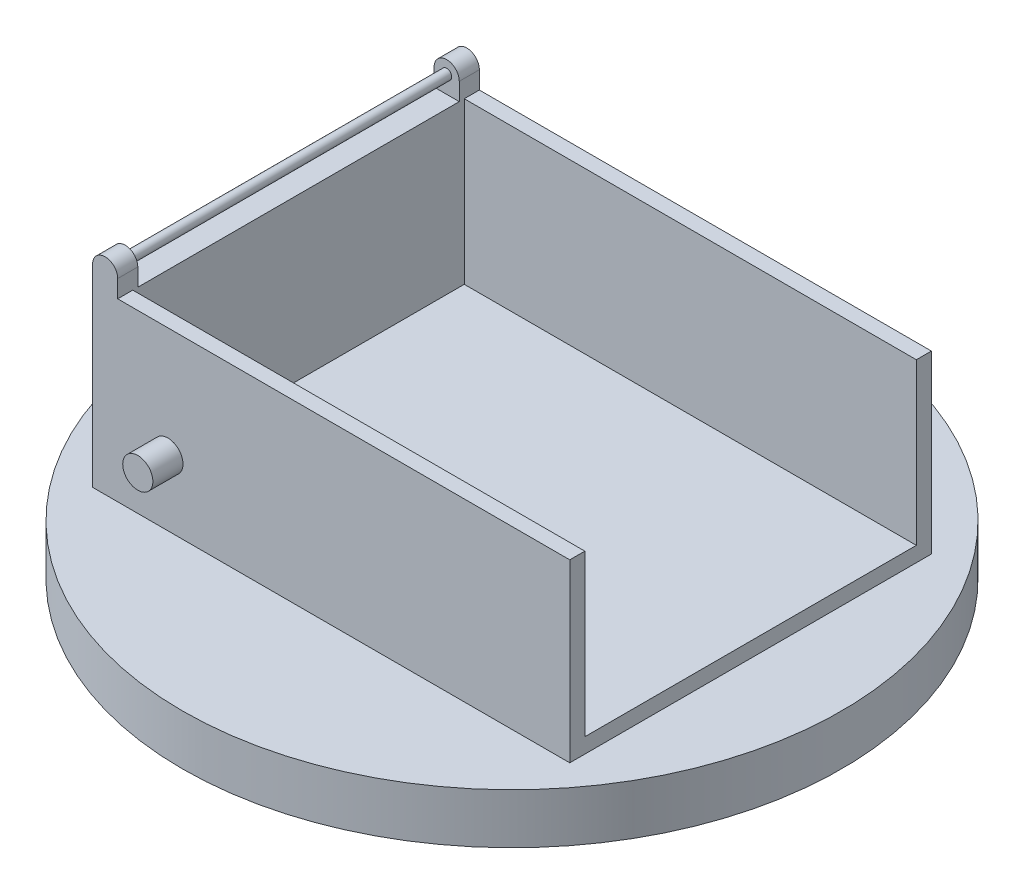
ISO-10303-21;
HEADER;
FILE_DESCRIPTION(('STEP AP214'),'2;1');
FILE_NAME('part.step','',(''),(''),'','','');
FILE_SCHEMA(('AUTOMOTIVE_DESIGN { 1 0 10303 214 1 1 1 1 }'));
ENDSEC;
DATA;
#1=APPLICATION_CONTEXT('core data for automotive mechanical design processes');
#2=APPLICATION_PROTOCOL_DEFINITION('international standard','automotive_design',2000,#1);
#3=PRODUCT_CONTEXT('',#1,'mechanical');
#4=PRODUCT('Part','Part','',(#3));
#5=PRODUCT_RELATED_PRODUCT_CATEGORY('part','',(#4));
#6=PRODUCT_DEFINITION_FORMATION('','',#4);
#7=PRODUCT_DEFINITION_CONTEXT('part definition',#1,'design');
#8=PRODUCT_DEFINITION('design','',#6,#7);
#9=PRODUCT_DEFINITION_SHAPE('','',#8);
#10=(LENGTH_UNIT() NAMED_UNIT(*) SI_UNIT(.MILLI.,.METRE.));
#11=(NAMED_UNIT(*) PLANE_ANGLE_UNIT() SI_UNIT($,.RADIAN.));
#12=(NAMED_UNIT(*) SI_UNIT($,.STERADIAN.) SOLID_ANGLE_UNIT());
#13=UNCERTAINTY_MEASURE_WITH_UNIT(LENGTH_MEASURE(1.E-05),#10,'distance_accuracy_value','');
#14=(GEOMETRIC_REPRESENTATION_CONTEXT(3) GLOBAL_UNCERTAINTY_ASSIGNED_CONTEXT((#13)) GLOBAL_UNIT_ASSIGNED_CONTEXT((#10,
#11,#12)) REPRESENTATION_CONTEXT('',''));
#15=CARTESIAN_POINT('',(0.,0.,0.));
#16=DIRECTION('',(0.,0.,1.));
#17=DIRECTION('',(1.,0.,0.));
#18=AXIS2_PLACEMENT_3D('',#15,#16,#17);
#19=CARTESIAN_POINT('',(0.,35.,0.));
#20=DIRECTION('',(0.,-1.,0.));
#21=DIRECTION('',(0.,0.,-1.));
#22=AXIS2_PLACEMENT_3D('',#19,#20,#21);
#23=PLANE('',#22);
#24=DIRECTION('',(0.,0.,-1.));
#25=VECTOR('',#24,1.);
#26=CARTESIAN_POINT('',(-42.5,35.,-32.));
#27=LINE('',#26,#25);
#28=CARTESIAN_POINT('',(-42.5,35.,-33.));
#29=VERTEX_POINT('',#28);
#30=CARTESIAN_POINT('',(-42.5,35.,-36.));
#31=VERTEX_POINT('',#30);
#32=EDGE_CURVE('E206',#29,#31,#27,.T.);
#33=ORIENTED_EDGE('',*,*,#32,.F.);
#34=DIRECTION('',(-1.,0.,0.));
#35=VECTOR('',#34,1.);
#36=CARTESIAN_POINT('',(-42.5,35.,-33.));
#37=LINE('',#36,#35);
#38=CARTESIAN_POINT('',(47.5,35.,-33.));
#39=VERTEX_POINT('',#38);
#40=EDGE_CURVE('E246',#39,#29,#37,.T.);
#41=ORIENTED_EDGE('',*,*,#40,.F.);
#42=DIRECTION('',(0.,0.,-1.));
#43=VECTOR('',#42,1.);
#44=CARTESIAN_POINT('',(47.5,35.,36.));
#45=LINE('',#44,#43);
#46=CARTESIAN_POINT('',(47.5,35.,-36.));
#47=VERTEX_POINT('',#46);
#48=EDGE_CURVE('E175',#39,#47,#45,.T.);
#49=ORIENTED_EDGE('',*,*,#48,.T.);
#50=DIRECTION('',(-1.,0.,0.));
#51=VECTOR('',#50,1.);
#52=CARTESIAN_POINT('',(-47.5,35.,-36.));
#53=LINE('',#52,#51);
#54=EDGE_CURVE('E155',#47,#31,#53,.T.);
#55=ORIENTED_EDGE('',*,*,#54,.T.);
#56=EDGE_LOOP('',(#33,#41,#49,#55));
#57=FACE_BOUND('',#56,.T.);
#58=ADVANCED_FACE('F35',(#57),#23,.F.);
#59=DIRECTION('',(1.,0.,0.));
#60=VECTOR('',#59,1.);
#61=CARTESIAN_POINT('',(-47.5,35.,-32.));
#62=LINE('',#61,#60);
#63=CARTESIAN_POINT('',(-47.5,35.,-32.));
#64=VERTEX_POINT('',#63);
#65=CARTESIAN_POINT('',(-42.5,35.,-32.));
#66=VERTEX_POINT('',#65);
#67=EDGE_CURVE('E52',#64,#66,#62,.T.);
#68=ORIENTED_EDGE('',*,*,#67,.F.);
#69=DIRECTION('',(0.,0.,1.));
#70=VECTOR('',#69,1.);
#71=CARTESIAN_POINT('',(-47.5,35.,36.));
#72=LINE('',#71,#70);
#73=CARTESIAN_POINT('',(-47.5,35.,32.));
#74=VERTEX_POINT('',#73);
#75=EDGE_CURVE('E269',#64,#74,#72,.T.);
#76=ORIENTED_EDGE('',*,*,#75,.T.);
#77=DIRECTION('',(1.,0.,0.));
#78=VECTOR('',#77,1.);
#79=CARTESIAN_POINT('',(-47.5,35.,32.));
#80=LINE('',#79,#78);
#81=CARTESIAN_POINT('',(-42.5,35.,32.));
#82=VERTEX_POINT('',#81);
#83=EDGE_CURVE('E210',#74,#82,#80,.T.);
#84=ORIENTED_EDGE('',*,*,#83,.T.);
#85=DIRECTION('',(0.,0.,1.));
#86=VECTOR('',#85,1.);
#87=CARTESIAN_POINT('',(-42.5,35.,33.));
#88=LINE('',#87,#86);
#89=EDGE_CURVE('E241',#66,#82,#88,.T.);
#90=ORIENTED_EDGE('',*,*,#89,.F.);
#91=EDGE_LOOP('',(#68,#76,#84,#90));
#92=FACE_BOUND('',#91,.T.);
#93=ADVANCED_FACE('F294',(#92),#23,.F.);
#94=CARTESIAN_POINT('',(47.5,35.,36.));
#95=DIRECTION('',(-1.,0.,0.));
#96=DIRECTION('',(0.,0.,1.));
#97=AXIS2_PLACEMENT_3D('',#94,#95,#96);
#98=PLANE('',#97);
#99=ORIENTED_EDGE('',*,*,#48,.F.);
#100=DIRECTION('',(0.,1.,0.));
#101=VECTOR('',#100,1.);
#102=CARTESIAN_POINT('',(47.5,3.,-33.));
#103=LINE('',#102,#101);
#104=CARTESIAN_POINT('',(47.5,3.,-33.));
#105=VERTEX_POINT('',#104);
#106=EDGE_CURVE('E166',#105,#39,#103,.T.);
#107=ORIENTED_EDGE('',*,*,#106,.F.);
#108=DIRECTION('',(0.,0.,-1.));
#109=VECTOR('',#108,1.);
#110=CARTESIAN_POINT('',(47.5,3.,33.));
#111=LINE('',#110,#109);
#112=CARTESIAN_POINT('',(47.5,3.,33.));
#113=VERTEX_POINT('',#112);
#114=EDGE_CURVE('E249',#113,#105,#111,.T.);
#115=ORIENTED_EDGE('',*,*,#114,.F.);
#116=DIRECTION('',(0.,1.,0.));
#117=VECTOR('',#116,1.);
#118=CARTESIAN_POINT('',(47.5,3.,33.));
#119=LINE('',#118,#117);
#120=CARTESIAN_POINT('',(47.5,35.,33.));
#121=VERTEX_POINT('',#120);
#122=EDGE_CURVE('E261',#113,#121,#119,.T.);
#123=ORIENTED_EDGE('',*,*,#122,.T.);
#124=CARTESIAN_POINT('',(47.5,35.,36.));
#125=VERTEX_POINT('',#124);
#126=EDGE_CURVE('E266',#125,#121,#45,.T.);
#127=ORIENTED_EDGE('',*,*,#126,.F.);
#128=DIRECTION('',(0.,-1.,0.));
#129=VECTOR('',#128,1.);
#130=CARTESIAN_POINT('',(47.5,35.,36.));
#131=LINE('',#130,#129);
#132=CARTESIAN_POINT('',(47.5,0.,36.));
#133=VERTEX_POINT('',#132);
#134=EDGE_CURVE('E162',#125,#133,#131,.T.);
#135=ORIENTED_EDGE('',*,*,#134,.T.);
#136=DIRECTION('',(0.,0.,-1.));
#137=VECTOR('',#136,1.);
#138=CARTESIAN_POINT('',(47.5,0.,36.));
#139=LINE('',#138,#137);
#140=CARTESIAN_POINT('',(47.5,0.,-36.));
#141=VERTEX_POINT('',#140);
#142=EDGE_CURVE('E142',#133,#141,#139,.T.);
#143=ORIENTED_EDGE('',*,*,#142,.T.);
#144=DIRECTION('',(0.,-1.,0.));
#145=VECTOR('',#144,1.);
#146=CARTESIAN_POINT('',(47.5,35.,-36.));
#147=LINE('',#146,#145);
#148=EDGE_CURVE('E151',#47,#141,#147,.T.);
#149=ORIENTED_EDGE('',*,*,#148,.F.);
#150=EDGE_LOOP('',(#99,#107,#115,#123,#127,#135,#143,#149));
#151=FACE_BOUND('',#150,.T.);
#152=ADVANCED_FACE('F37',(#151),#98,.F.);
#153=CARTESIAN_POINT('',(-47.5,35.,-36.));
#154=DIRECTION('',(0.,0.,1.));
#155=DIRECTION('',(1.,0.,0.));
#156=AXIS2_PLACEMENT_3D('',#153,#154,#155);
#157=PLANE('',#156);
#158=CARTESIAN_POINT('',(-32.5,13.,-36.));
#159=DIRECTION('',(0.,0.,1.));
#160=DIRECTION('',(1.,0.,0.));
#161=AXIS2_PLACEMENT_3D('',#158,#159,#160);
#162=CIRCLE('',#161,3.);
#163=CARTESIAN_POINT('',(-29.5,13.,-36.));
#164=VERTEX_POINT('',#163);
#165=EDGE_CURVE('E230',#164,#164,#162,.T.);
#166=ORIENTED_EDGE('',*,*,#165,.T.);
#167=EDGE_LOOP('',(#166));
#168=FACE_BOUND('',#167,.T.);
#169=DIRECTION('',(-1.,0.,0.));
#170=VECTOR('',#169,1.);
#171=CARTESIAN_POINT('',(-47.5,0.,-36.));
#172=LINE('',#171,#170);
#173=CARTESIAN_POINT('',(-47.5,0.,-36.));
#174=VERTEX_POINT('',#173);
#175=EDGE_CURVE('E137',#141,#174,#172,.T.);
#176=ORIENTED_EDGE('',*,*,#175,.T.);
#177=DIRECTION('',(0.,-1.,0.));
#178=VECTOR('',#177,1.);
#179=CARTESIAN_POINT('',(-47.5,35.,-36.));
#180=LINE('',#179,#178);
#181=CARTESIAN_POINT('',(-47.5,38.5,-36.));
#182=VERTEX_POINT('',#181);
#183=EDGE_CURVE('E158',#182,#174,#180,.T.);
#184=ORIENTED_EDGE('',*,*,#183,.F.);
#185=CARTESIAN_POINT('',(-45.,38.5,-36.));
#186=DIRECTION('',(0.,0.,1.));
#187=DIRECTION('',(1.,0.,0.));
#188=AXIS2_PLACEMENT_3D('',#185,#186,#187);
#189=CIRCLE('',#188,2.5);
#190=CARTESIAN_POINT('',(-42.5,38.5,-36.));
#191=VERTEX_POINT('',#190);
#192=EDGE_CURVE('E188',#191,#182,#189,.T.);
#193=ORIENTED_EDGE('',*,*,#192,.F.);
#194=DIRECTION('',(0.,1.,0.));
#195=VECTOR('',#194,1.);
#196=CARTESIAN_POINT('',(-42.5,35.,-36.));
#197=LINE('',#196,#195);
#198=EDGE_CURVE('E195',#31,#191,#197,.T.);
#199=ORIENTED_EDGE('',*,*,#198,.F.);
#200=ORIENTED_EDGE('',*,*,#54,.F.);
#201=ORIENTED_EDGE('',*,*,#148,.T.);
#202=EDGE_LOOP('',(#176,#184,#193,#199,#200,#201));
#203=FACE_BOUND('',#202,.T.);
#204=ADVANCED_FACE('F152',(#168,#203),#157,.F.);
#205=CARTESIAN_POINT('',(-47.5,35.,36.));
#206=DIRECTION('',(1.,0.,0.));
#207=DIRECTION('',(0.,0.,-1.));
#208=AXIS2_PLACEMENT_3D('',#205,#206,#207);
#209=PLANE('',#208);
#210=DIRECTION('',(0.,0.,1.));
#211=VECTOR('',#210,1.);
#212=CARTESIAN_POINT('',(-47.5,0.,36.));
#213=LINE('',#212,#211);
#214=CARTESIAN_POINT('',(-47.5,0.,36.));
#215=VERTEX_POINT('',#214);
#216=EDGE_CURVE('E145',#174,#215,#213,.T.);
#217=ORIENTED_EDGE('',*,*,#216,.T.);
#218=DIRECTION('',(0.,-1.,0.));
#219=VECTOR('',#218,1.);
#220=CARTESIAN_POINT('',(-47.5,35.,36.));
#221=LINE('',#220,#219);
#222=CARTESIAN_POINT('',(-47.5,38.5,36.));
#223=VERTEX_POINT('',#222);
#224=EDGE_CURVE('E177',#223,#215,#221,.T.);
#225=ORIENTED_EDGE('',*,*,#224,.F.);
#226=DIRECTION('',(0.,0.,1.));
#227=VECTOR('',#226,1.);
#228=CARTESIAN_POINT('',(-47.5,38.5,32.));
#229=LINE('',#228,#227);
#230=CARTESIAN_POINT('',(-47.5,38.5,32.));
#231=VERTEX_POINT('',#230);
#232=EDGE_CURVE('E227',#231,#223,#229,.T.);
#233=ORIENTED_EDGE('',*,*,#232,.F.);
#234=DIRECTION('',(0.,-1.,0.));
#235=VECTOR('',#234,1.);
#236=CARTESIAN_POINT('',(-47.5,35.,32.));
#237=LINE('',#236,#235);
#238=EDGE_CURVE('E220',#231,#74,#237,.T.);
#239=ORIENTED_EDGE('',*,*,#238,.T.);
#240=ORIENTED_EDGE('',*,*,#75,.F.);
#241=DIRECTION('',(0.,-1.,0.));
#242=VECTOR('',#241,1.);
#243=CARTESIAN_POINT('',(-47.5,35.,-32.));
#244=LINE('',#243,#242);
#245=CARTESIAN_POINT('',(-47.5,38.5,-32.));
#246=VERTEX_POINT('',#245);
#247=EDGE_CURVE('E546',#246,#64,#244,.T.);
#248=ORIENTED_EDGE('',*,*,#247,.F.);
#249=DIRECTION('',(0.,0.,-1.));
#250=VECTOR('',#249,1.);
#251=CARTESIAN_POINT('',(-47.5,38.5,-32.));
#252=LINE('',#251,#250);
#253=EDGE_CURVE('E185',#246,#182,#252,.T.);
#254=ORIENTED_EDGE('',*,*,#253,.T.);
#255=ORIENTED_EDGE('',*,*,#183,.T.);
#256=EDGE_LOOP('',(#217,#225,#233,#239,#240,#248,#254,#255));
#257=FACE_BOUND('',#256,.T.);
#258=ADVANCED_FACE('F182',(#257),#209,.F.);
#259=CARTESIAN_POINT('',(-47.5,35.,36.));
#260=DIRECTION('',(0.,0.,-1.));
#261=DIRECTION('',(-1.,0.,0.));
#262=AXIS2_PLACEMENT_3D('',#259,#260,#261);
#263=PLANE('',#262);
#264=CARTESIAN_POINT('',(-32.5,13.,36.));
#265=DIRECTION('',(0.,0.,-1.));
#266=DIRECTION('',(-1.,0.,0.));
#267=AXIS2_PLACEMENT_3D('',#264,#265,#266);
#268=CIRCLE('',#267,3.);
#269=CARTESIAN_POINT('',(-35.5,13.,36.));
#270=VERTEX_POINT('',#269);
#271=EDGE_CURVE('E39',#270,#270,#268,.F.);
#272=ORIENTED_EDGE('',*,*,#271,.F.);
#273=EDGE_LOOP('',(#272));
#274=FACE_BOUND('',#273,.T.);
#275=DIRECTION('',(1.,0.,0.));
#276=VECTOR('',#275,1.);
#277=CARTESIAN_POINT('',(-47.5,0.,36.));
#278=LINE('',#277,#276);
#279=EDGE_CURVE('E173',#215,#133,#278,.T.);
#280=ORIENTED_EDGE('',*,*,#279,.T.);
#281=ORIENTED_EDGE('',*,*,#134,.F.);
#282=DIRECTION('',(1.,0.,0.));
#283=VECTOR('',#282,1.);
#284=CARTESIAN_POINT('',(-47.5,35.,36.));
#285=LINE('',#284,#283);
#286=CARTESIAN_POINT('',(-42.5,35.,36.));
#287=VERTEX_POINT('',#286);
#288=EDGE_CURVE('E169',#287,#125,#285,.T.);
#289=ORIENTED_EDGE('',*,*,#288,.F.);
#290=DIRECTION('',(0.,1.,0.));
#291=VECTOR('',#290,1.);
#292=CARTESIAN_POINT('',(-42.5,35.,36.));
#293=LINE('',#292,#291);
#294=CARTESIAN_POINT('',(-42.5,38.5,36.));
#295=VERTEX_POINT('',#294);
#296=EDGE_CURVE('E60',#287,#295,#293,.T.);
#297=ORIENTED_EDGE('',*,*,#296,.T.);
#298=CARTESIAN_POINT('',(-45.,38.5,36.));
#299=DIRECTION('',(0.,0.,1.));
#300=DIRECTION('',(1.,0.,0.));
#301=AXIS2_PLACEMENT_3D('',#298,#299,#300);
#302=CIRCLE('',#301,2.5);
#303=EDGE_CURVE('E214',#295,#223,#302,.T.);
#304=ORIENTED_EDGE('',*,*,#303,.T.);
#305=ORIENTED_EDGE('',*,*,#224,.T.);
#306=EDGE_LOOP('',(#280,#281,#289,#297,#304,#305));
#307=FACE_BOUND('',#306,.T.);
#308=ADVANCED_FACE('F278',(#274,#307),#263,.F.);
#309=DIRECTION('',(1.,0.,0.));
#310=VECTOR('',#309,1.);
#311=CARTESIAN_POINT('',(-42.5,35.,33.));
#312=LINE('',#311,#310);
#313=CARTESIAN_POINT('',(-42.5,35.,33.));
#314=VERTEX_POINT('',#313);
#315=EDGE_CURVE('E256',#314,#121,#312,.T.);
#316=ORIENTED_EDGE('',*,*,#315,.F.);
#317=DIRECTION('',(0.,0.,1.));
#318=VECTOR('',#317,1.);
#319=CARTESIAN_POINT('',(-42.5,35.,32.));
#320=LINE('',#319,#318);
#321=EDGE_CURVE('E44',#314,#287,#320,.T.);
#322=ORIENTED_EDGE('',*,*,#321,.T.);
#323=ORIENTED_EDGE('',*,*,#288,.T.);
#324=ORIENTED_EDGE('',*,*,#126,.T.);
#325=EDGE_LOOP('',(#316,#322,#323,#324));
#326=FACE_BOUND('',#325,.T.);
#327=ADVANCED_FACE('F276',(#326),#23,.F.);
#328=CARTESIAN_POINT('',(-42.5,3.,33.));
#329=DIRECTION('',(-1.,0.,0.));
#330=DIRECTION('',(0.,0.,1.));
#331=AXIS2_PLACEMENT_3D('',#328,#329,#330);
#332=PLANE('',#331);
#333=DIRECTION('',(0.,1.,0.));
#334=VECTOR('',#333,1.);
#335=CARTESIAN_POINT('',(-42.5,3.,-33.));
#336=LINE('',#335,#334);
#337=CARTESIAN_POINT('',(-42.5,3.,-33.));
#338=VERTEX_POINT('',#337);
#339=EDGE_CURVE('E163',#338,#29,#336,.T.);
#340=ORIENTED_EDGE('',*,*,#339,.T.);
#341=ORIENTED_EDGE('',*,*,#32,.T.);
#342=ORIENTED_EDGE('',*,*,#198,.T.);
#343=DIRECTION('',(0.,0.,-1.));
#344=VECTOR('',#343,1.);
#345=CARTESIAN_POINT('',(-42.5,38.5,-32.));
#346=LINE('',#345,#344);
#347=CARTESIAN_POINT('',(-42.5,38.5,-32.));
#348=VERTEX_POINT('',#347);
#349=EDGE_CURVE('E194',#348,#191,#346,.T.);
#350=ORIENTED_EDGE('',*,*,#349,.F.);
#351=DIRECTION('',(0.,1.,0.));
#352=VECTOR('',#351,1.);
#353=CARTESIAN_POINT('',(-42.5,35.,-32.));
#354=LINE('',#353,#352);
#355=EDGE_CURVE('E203',#66,#348,#354,.T.);
#356=ORIENTED_EDGE('',*,*,#355,.F.);
#357=ORIENTED_EDGE('',*,*,#89,.T.);
#358=DIRECTION('',(0.,1.,0.));
#359=VECTOR('',#358,1.);
#360=CARTESIAN_POINT('',(-42.5,35.,32.));
#361=LINE('',#360,#359);
#362=CARTESIAN_POINT('',(-42.5,38.5,32.));
#363=VERTEX_POINT('',#362);
#364=EDGE_CURVE('E213',#82,#363,#361,.T.);
#365=ORIENTED_EDGE('',*,*,#364,.T.);
#366=DIRECTION('',(0.,0.,1.));
#367=VECTOR('',#366,1.);
#368=CARTESIAN_POINT('',(-42.5,38.5,32.));
#369=LINE('',#368,#367);
#370=EDGE_CURVE('E223',#363,#295,#369,.T.);
#371=ORIENTED_EDGE('',*,*,#370,.T.);
#372=ORIENTED_EDGE('',*,*,#296,.F.);
#373=ORIENTED_EDGE('',*,*,#321,.F.);
#374=DIRECTION('',(0.,1.,0.));
#375=VECTOR('',#374,1.);
#376=CARTESIAN_POINT('',(-42.5,3.,33.));
#377=LINE('',#376,#375);
#378=CARTESIAN_POINT('',(-42.5,3.,33.));
#379=VERTEX_POINT('',#378);
#380=EDGE_CURVE('E254',#379,#314,#377,.T.);
#381=ORIENTED_EDGE('',*,*,#380,.F.);
#382=DIRECTION('',(0.,0.,1.));
#383=VECTOR('',#382,1.);
#384=CARTESIAN_POINT('',(-42.5,3.,33.));
#385=LINE('',#384,#383);
#386=EDGE_CURVE('E242',#338,#379,#385,.T.);
#387=ORIENTED_EDGE('',*,*,#386,.F.);
#388=EDGE_LOOP('',(#340,#341,#342,#350,#356,#357,#365,#371,#372,#373,#381,#387));
#389=FACE_BOUND('',#388,.T.);
#390=ADVANCED_FACE('F288',(#389),#332,.F.);
#391=CARTESIAN_POINT('',(-42.5,3.,-33.));
#392=DIRECTION('',(0.,0.,-1.));
#393=DIRECTION('',(-1.,0.,0.));
#394=AXIS2_PLACEMENT_3D('',#391,#392,#393);
#395=PLANE('',#394);
#396=ORIENTED_EDGE('',*,*,#40,.T.);
#397=ORIENTED_EDGE('',*,*,#339,.F.);
#398=DIRECTION('',(-1.,0.,0.));
#399=VECTOR('',#398,1.);
#400=CARTESIAN_POINT('',(-42.5,3.,-33.));
#401=LINE('',#400,#399);
#402=EDGE_CURVE('E251',#105,#338,#401,.T.);
#403=ORIENTED_EDGE('',*,*,#402,.F.);
#404=ORIENTED_EDGE('',*,*,#106,.T.);
#405=EDGE_LOOP('',(#396,#397,#403,#404));
#406=FACE_BOUND('',#405,.T.);
#407=ADVANCED_FACE('F291',(#406),#395,.F.);
#408=CARTESIAN_POINT('',(-42.5,3.,33.));
#409=DIRECTION('',(0.,0.,1.));
#410=DIRECTION('',(1.,0.,0.));
#411=AXIS2_PLACEMENT_3D('',#408,#409,#410);
#412=PLANE('',#411);
#413=ORIENTED_EDGE('',*,*,#315,.T.);
#414=ORIENTED_EDGE('',*,*,#122,.F.);
#415=DIRECTION('',(1.,0.,0.));
#416=VECTOR('',#415,1.);
#417=CARTESIAN_POINT('',(-42.5,3.,33.));
#418=LINE('',#417,#416);
#419=EDGE_CURVE('E245',#379,#113,#418,.T.);
#420=ORIENTED_EDGE('',*,*,#419,.F.);
#421=ORIENTED_EDGE('',*,*,#380,.T.);
#422=EDGE_LOOP('',(#413,#414,#420,#421));
#423=FACE_BOUND('',#422,.T.);
#424=ADVANCED_FACE('F283',(#423),#412,.F.);
#425=CARTESIAN_POINT('',(0.,3.,0.));
#426=DIRECTION('',(0.,-1.,0.));
#427=DIRECTION('',(0.,0.,-1.));
#428=AXIS2_PLACEMENT_3D('',#425,#426,#427);
#429=PLANE('',#428);
#430=ORIENTED_EDGE('',*,*,#386,.T.);
#431=ORIENTED_EDGE('',*,*,#419,.T.);
#432=ORIENTED_EDGE('',*,*,#114,.T.);
#433=ORIENTED_EDGE('',*,*,#402,.T.);
#434=EDGE_LOOP('',(#430,#431,#432,#433));
#435=FACE_BOUND('',#434,.T.);
#436=ADVANCED_FACE('F285',(#435),#429,.F.);
#437=CARTESIAN_POINT('',(-32.5,13.,42.));
#438=DIRECTION('',(0.,0.,-1.));
#439=DIRECTION('',(-1.,0.,0.));
#440=AXIS2_PLACEMENT_3D('',#437,#438,#439);
#441=CYLINDRICAL_SURFACE('',#440,3.);
#442=CARTESIAN_POINT('',(-32.5,13.,42.));
#443=DIRECTION('',(0.,0.,1.));
#444=DIRECTION('',(1.,0.,0.));
#445=AXIS2_PLACEMENT_3D('',#442,#443,#444);
#446=CIRCLE('',#445,3.);
#447=CARTESIAN_POINT('',(-29.5,13.,42.));
#448=VERTEX_POINT('',#447);
#449=EDGE_CURVE('E236',#448,#448,#446,.T.);
#450=ORIENTED_EDGE('',*,*,#449,.F.);
#451=EDGE_LOOP('',(#450));
#452=FACE_BOUND('',#451,.T.);
#453=ORIENTED_EDGE('',*,*,#271,.T.);
#454=EDGE_LOOP('',(#453));
#455=FACE_BOUND('',#454,.T.);
#456=ADVANCED_FACE('F332',(#452,#455),#441,.T.);
#457=CARTESIAN_POINT('',(-32.5,13.,42.));
#458=DIRECTION('',(0.,0.,1.));
#459=DIRECTION('',(1.,0.,0.));
#460=AXIS2_PLACEMENT_3D('',#457,#458,#459);
#461=PLANE('',#460);
#462=ORIENTED_EDGE('',*,*,#449,.T.);
#463=EDGE_LOOP('',(#462));
#464=FACE_BOUND('',#463,.T.);
#465=ADVANCED_FACE('F322',(#464),#461,.T.);
#466=CARTESIAN_POINT('',(-32.5,13.,-42.));
#467=DIRECTION('',(0.,0.,1.));
#468=DIRECTION('',(1.,0.,0.));
#469=AXIS2_PLACEMENT_3D('',#466,#467,#468);
#470=CYLINDRICAL_SURFACE('',#469,3.);
#471=CARTESIAN_POINT('',(-32.5,13.,-42.));
#472=DIRECTION('',(0.,0.,1.));
#473=DIRECTION('',(1.,0.,0.));
#474=AXIS2_PLACEMENT_3D('',#471,#472,#473);
#475=CIRCLE('',#474,3.);
#476=CARTESIAN_POINT('',(-29.5,13.,-42.));
#477=VERTEX_POINT('',#476);
#478=EDGE_CURVE('E233',#477,#477,#475,.T.);
#479=ORIENTED_EDGE('',*,*,#478,.T.);
#480=EDGE_LOOP('',(#479));
#481=FACE_BOUND('',#480,.T.);
#482=ORIENTED_EDGE('',*,*,#165,.F.);
#483=EDGE_LOOP('',(#482));
#484=FACE_BOUND('',#483,.T.);
#485=ADVANCED_FACE('F319',(#481,#484),#470,.T.);
#486=CARTESIAN_POINT('',(-32.5,13.,-42.));
#487=DIRECTION('',(0.,0.,-1.));
#488=DIRECTION('',(1.,0.,0.));
#489=AXIS2_PLACEMENT_3D('',#486,#487,#488);
#490=PLANE('',#489);
#491=ORIENTED_EDGE('',*,*,#478,.F.);
#492=EDGE_LOOP('',(#491));
#493=FACE_BOUND('',#492,.T.);
#494=ADVANCED_FACE('F321',(#493),#490,.T.);
#495=CARTESIAN_POINT('',(-45.,38.5,32.));
#496=DIRECTION('',(0.,0.,1.));
#497=DIRECTION('',(1.,0.,0.));
#498=AXIS2_PLACEMENT_3D('',#495,#496,#497);
#499=CYLINDRICAL_SURFACE('',#498,2.5);
#500=ORIENTED_EDGE('',*,*,#303,.F.);
#501=ORIENTED_EDGE('',*,*,#370,.F.);
#502=CARTESIAN_POINT('',(-45.,38.5,32.));
#503=DIRECTION('',(0.,0.,1.));
#504=DIRECTION('',(1.,0.,0.));
#505=AXIS2_PLACEMENT_3D('',#502,#503,#504);
#506=CIRCLE('',#505,2.5);
#507=EDGE_CURVE('E217',#363,#231,#506,.T.);
#508=ORIENTED_EDGE('',*,*,#507,.T.);
#509=ORIENTED_EDGE('',*,*,#232,.T.);
#510=EDGE_LOOP('',(#500,#501,#508,#509));
#511=FACE_BOUND('',#510,.T.);
#512=ADVANCED_FACE('F329',(#511),#499,.T.);
#513=CARTESIAN_POINT('',(-45.,38.5,32.));
#514=DIRECTION('',(0.,0.,1.));
#515=DIRECTION('',(1.,0.,0.));
#516=AXIS2_PLACEMENT_3D('',#513,#514,#515);
#517=PLANE('',#516);
#518=CARTESIAN_POINT('',(-45.,38.5,32.));
#519=DIRECTION('',(0.,0.,1.));
#520=DIRECTION('',(1.,0.,0.));
#521=AXIS2_PLACEMENT_3D('',#518,#519,#520);
#522=CIRCLE('',#521,0.999999999999998);
#523=CARTESIAN_POINT('',(-44.,38.5,32.));
#524=VERTEX_POINT('',#523);
#525=EDGE_CURVE('E559',#524,#524,#522,.T.);
#526=ORIENTED_EDGE('',*,*,#525,.T.);
#527=EDGE_LOOP('',(#526));
#528=FACE_BOUND('',#527,.T.);
#529=ORIENTED_EDGE('',*,*,#83,.F.);
#530=ORIENTED_EDGE('',*,*,#238,.F.);
#531=ORIENTED_EDGE('',*,*,#507,.F.);
#532=ORIENTED_EDGE('',*,*,#364,.F.);
#533=EDGE_LOOP('',(#529,#530,#531,#532));
#534=FACE_BOUND('',#533,.T.);
#535=ADVANCED_FACE('F414',(#528,#534),#517,.F.);
#536=CARTESIAN_POINT('',(-45.,38.5,-32.));
#537=DIRECTION('',(0.,0.,-1.));
#538=DIRECTION('',(-1.,0.,0.));
#539=AXIS2_PLACEMENT_3D('',#536,#537,#538);
#540=CYLINDRICAL_SURFACE('',#539,2.5);
#541=ORIENTED_EDGE('',*,*,#192,.T.);
#542=ORIENTED_EDGE('',*,*,#253,.F.);
#543=CARTESIAN_POINT('',(-45.,38.5,-32.));
#544=DIRECTION('',(0.,0.,1.));
#545=DIRECTION('',(1.,0.,0.));
#546=AXIS2_PLACEMENT_3D('',#543,#544,#545);
#547=CIRCLE('',#546,2.5);
#548=EDGE_CURVE('E545',#348,#246,#547,.T.);
#549=ORIENTED_EDGE('',*,*,#548,.F.);
#550=ORIENTED_EDGE('',*,*,#349,.T.);
#551=EDGE_LOOP('',(#541,#542,#549,#550));
#552=FACE_BOUND('',#551,.T.);
#553=ADVANCED_FACE('F191',(#552),#540,.T.);
#554=CARTESIAN_POINT('',(-45.,38.5,-32.));
#555=DIRECTION('',(0.,0.,-1.));
#556=DIRECTION('',(1.,0.,0.));
#557=AXIS2_PLACEMENT_3D('',#554,#555,#556);
#558=PLANE('',#557);
#559=CARTESIAN_POINT('',(-45.,38.5,-32.));
#560=DIRECTION('',(0.,0.,-1.));
#561=DIRECTION('',(-1.,0.,0.));
#562=AXIS2_PLACEMENT_3D('',#559,#560,#561);
#563=CIRCLE('',#562,0.999999999999998);
#564=CARTESIAN_POINT('',(-46.,38.5,-32.));
#565=VERTEX_POINT('',#564);
#566=EDGE_CURVE('E564',#565,#565,#563,.F.);
#567=ORIENTED_EDGE('',*,*,#566,.F.);
#568=EDGE_LOOP('',(#567));
#569=FACE_BOUND('',#568,.T.);
#570=ORIENTED_EDGE('',*,*,#67,.T.);
#571=ORIENTED_EDGE('',*,*,#355,.T.);
#572=ORIENTED_EDGE('',*,*,#548,.T.);
#573=ORIENTED_EDGE('',*,*,#247,.T.);
#574=EDGE_LOOP('',(#570,#571,#572,#573));
#575=FACE_BOUND('',#574,.T.);
#576=ADVANCED_FACE('F413',(#569,#575),#558,.F.);
#577=CARTESIAN_POINT('',(0.,-10.,0.));
#578=DIRECTION('',(0.,1.,0.));
#579=DIRECTION('',(0.,0.,1.));
#580=AXIS2_PLACEMENT_3D('',#577,#578,#579);
#581=CYLINDRICAL_SURFACE('',#580,65.6117581712932);
#582=CARTESIAN_POINT('',(0.,-10.,0.));
#583=DIRECTION('',(0.,-1.,0.));
#584=DIRECTION('',(0.,0.,-1.));
#585=AXIS2_PLACEMENT_3D('',#582,#583,#584);
#586=CIRCLE('',#585,65.6117581712932);
#587=CARTESIAN_POINT('',(0.,-10.,-65.6117581712932));
#588=VERTEX_POINT('',#587);
#589=EDGE_CURVE('E196',#588,#588,#586,.T.);
#590=ORIENTED_EDGE('',*,*,#589,.F.);
#591=EDGE_LOOP('',(#590));
#592=FACE_BOUND('',#591,.T.);
#593=CARTESIAN_POINT('',(0.,0.,0.));
#594=DIRECTION('',(0.,-1.,0.));
#595=DIRECTION('',(0.,0.,-1.));
#596=AXIS2_PLACEMENT_3D('',#593,#594,#595);
#597=CIRCLE('',#596,65.6117581712932);
#598=CARTESIAN_POINT('',(0.,0.,-65.6117581712932));
#599=VERTEX_POINT('',#598);
#600=EDGE_CURVE('E200',#599,#599,#597,.T.);
#601=ORIENTED_EDGE('',*,*,#600,.T.);
#602=EDGE_LOOP('',(#601));
#603=FACE_BOUND('',#602,.T.);
#604=ADVANCED_FACE('F440',(#592,#603),#581,.T.);
#605=CARTESIAN_POINT('',(0.,-10.,0.));
#606=DIRECTION('',(0.,-1.,0.));
#607=DIRECTION('',(0.,0.,-1.));
#608=AXIS2_PLACEMENT_3D('',#605,#606,#607);
#609=PLANE('',#608);
#610=CARTESIAN_POINT('',(0.,-10.,0.));
#611=DIRECTION('',(0.,-1.,0.));
#612=DIRECTION('',(0.,0.,-1.));
#613=AXIS2_PLACEMENT_3D('',#610,#611,#612);
#614=CIRCLE('',#613,17.6404248050148);
#615=CARTESIAN_POINT('',(0.,-10.,-17.6404248050148));
#616=VERTEX_POINT('',#615);
#617=EDGE_CURVE('E11',#616,#616,#614,.T.);
#618=ORIENTED_EDGE('',*,*,#617,.F.);
#619=EDGE_LOOP('',(#618));
#620=FACE_BOUND('',#619,.T.);
#621=ORIENTED_EDGE('',*,*,#589,.T.);
#622=EDGE_LOOP('',(#621));
#623=FACE_BOUND('',#622,.T.);
#624=ADVANCED_FACE('F445',(#620,#623),#609,.T.);
#625=CARTESIAN_POINT('',(0.,0.,0.));
#626=DIRECTION('',(0.,-1.,0.));
#627=DIRECTION('',(0.,0.,-1.));
#628=AXIS2_PLACEMENT_3D('',#625,#626,#627);
#629=PLANE('',#628);
#630=ORIENTED_EDGE('',*,*,#142,.F.);
#631=ORIENTED_EDGE('',*,*,#279,.F.);
#632=ORIENTED_EDGE('',*,*,#216,.F.);
#633=ORIENTED_EDGE('',*,*,#175,.F.);
#634=EDGE_LOOP('',(#630,#631,#632,#633));
#635=FACE_BOUND('',#634,.T.);
#636=ORIENTED_EDGE('',*,*,#600,.F.);
#637=EDGE_LOOP('',(#636));
#638=FACE_BOUND('',#637,.T.);
#639=ADVANCED_FACE('F139',(#635,#638),#629,.F.);
#640=CARTESIAN_POINT('',(0.,-40.,0.));
#641=DIRECTION('',(0.,-1.,0.));
#642=DIRECTION('',(0.,0.,-1.));
#643=AXIS2_PLACEMENT_3D('',#640,#641,#642);
#644=PLANE('',#643);
#645=CARTESIAN_POINT('',(0.,-40.,0.));
#646=DIRECTION('',(0.,-1.,0.));
#647=DIRECTION('',(0.,0.,-1.));
#648=AXIS2_PLACEMENT_3D('',#645,#646,#647);
#649=CIRCLE('',#648,17.6404248050148);
#650=CARTESIAN_POINT('',(0.,-40.,-17.6404248050148));
#651=VERTEX_POINT('',#650);
#652=EDGE_CURVE('E551',#651,#651,#649,.T.);
#653=ORIENTED_EDGE('',*,*,#652,.T.);
#654=EDGE_LOOP('',(#653));
#655=FACE_BOUND('',#654,.T.);
#656=CARTESIAN_POINT('',(0.,-40.,0.));
#657=DIRECTION('',(0.,-1.,0.));
#658=DIRECTION('',(0.,0.,-1.));
#659=AXIS2_PLACEMENT_3D('',#656,#657,#658);
#660=CIRCLE('',#659,8.1224166368416);
#661=CARTESIAN_POINT('',(0.,-40.,-8.1224166368416));
#662=VERTEX_POINT('',#661);
#663=EDGE_CURVE('E555',#662,#662,#660,.T.);
#664=ORIENTED_EDGE('',*,*,#663,.F.);
#665=EDGE_LOOP('',(#664));
#666=FACE_BOUND('',#665,.T.);
#667=ADVANCED_FACE('F457',(#655,#666),#644,.T.);
#668=CARTESIAN_POINT('',(0.,-40.,0.));
#669=DIRECTION('',(0.,1.,0.));
#670=DIRECTION('',(0.,0.,1.));
#671=AXIS2_PLACEMENT_3D('',#668,#669,#670);
#672=CYLINDRICAL_SURFACE('',#671,17.6404248050148);
#673=ORIENTED_EDGE('',*,*,#652,.F.);
#674=EDGE_LOOP('',(#673));
#675=FACE_BOUND('',#674,.T.);
#676=ORIENTED_EDGE('',*,*,#617,.T.);
#677=EDGE_LOOP('',(#676));
#678=FACE_BOUND('',#677,.T.);
#679=ADVANCED_FACE('F475',(#675,#678),#672,.T.);
#680=CARTESIAN_POINT('',(0.,-40.,0.));
#681=DIRECTION('',(0.,1.,0.));
#682=DIRECTION('',(0.,0.,1.));
#683=AXIS2_PLACEMENT_3D('',#680,#681,#682);
#684=CYLINDRICAL_SURFACE('',#683,8.1224166368416);
#685=ORIENTED_EDGE('',*,*,#663,.T.);
#686=EDGE_LOOP('',(#685));
#687=FACE_BOUND('',#686,.T.);
#688=CARTESIAN_POINT('',(0.,-10.,0.));
#689=DIRECTION('',(0.,-1.,0.));
#690=DIRECTION('',(0.,0.,-1.));
#691=AXIS2_PLACEMENT_3D('',#688,#689,#690);
#692=CIRCLE('',#691,8.1224166368416);
#693=CARTESIAN_POINT('',(0.,-10.,-8.1224166368416));
#694=VERTEX_POINT('',#693);
#695=EDGE_CURVE('E556',#694,#694,#692,.T.);
#696=ORIENTED_EDGE('',*,*,#695,.F.);
#697=EDGE_LOOP('',(#696));
#698=FACE_BOUND('',#697,.T.);
#699=ADVANCED_FACE('F485',(#687,#698),#684,.F.);
#700=ORIENTED_EDGE('',*,*,#695,.T.);
#701=EDGE_LOOP('',(#700));
#702=FACE_BOUND('',#701,.T.);
#703=ADVANCED_FACE('F468',(#702),#609,.T.);
#704=CARTESIAN_POINT('',(-45.,38.5,-34.8284271247462));
#705=DIRECTION('',(0.,0.,1.));
#706=DIRECTION('',(1.,0.,0.));
#707=AXIS2_PLACEMENT_3D('',#704,#705,#706);
#708=CYLINDRICAL_SURFACE('',#707,0.999999999999998);
#709=ORIENTED_EDGE('',*,*,#566,.T.);
#710=EDGE_LOOP('',(#709));
#711=FACE_BOUND('',#710,.T.);
#712=ORIENTED_EDGE('',*,*,#525,.F.);
#713=EDGE_LOOP('',(#712));
#714=FACE_BOUND('',#713,.T.);
#715=ADVANCED_FACE('F503',(#711,#714),#708,.T.);
#716=CLOSED_SHELL('',(#58,#93,#152,#204,#258,#308,#327,#390,#407,#424,#436,#456,#465,#485,#494,
#512,#535,#553,#576,#604,#624,#639,#667,#679,#699,#703,#715));
#717=MANIFOLD_SOLID_BREP('B2',#716);
#718=ADVANCED_BREP_SHAPE_REPRESENTATION('',(#18,#717),#14);
#719=SHAPE_DEFINITION_REPRESENTATION(#9,#718);
ENDSEC;
END-ISO-10303-21;
